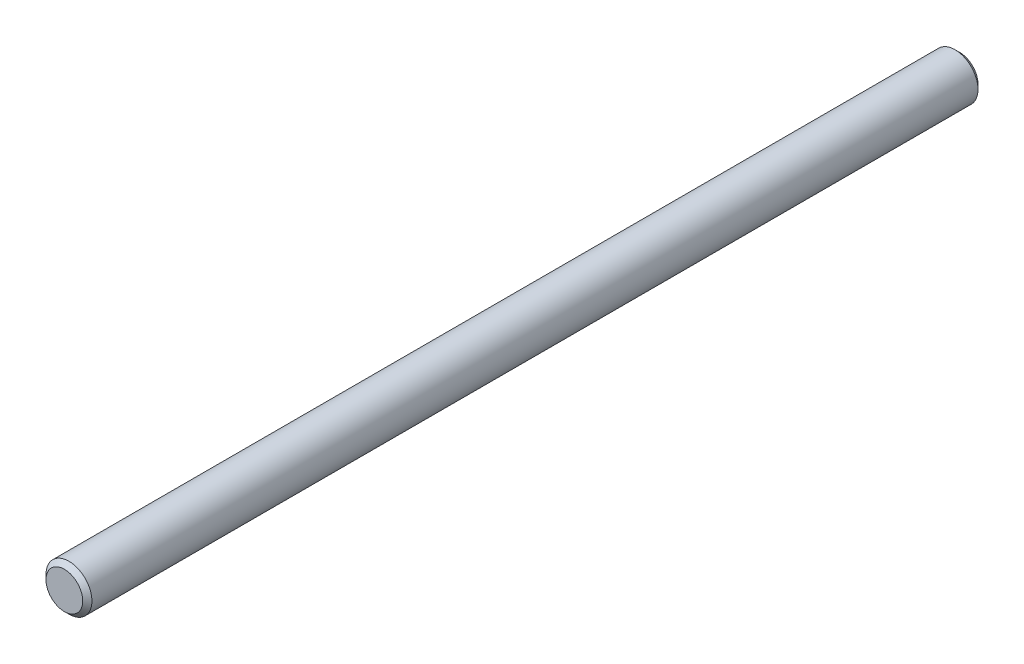
ISO-10303-21;
HEADER;
FILE_DESCRIPTION(('STEP AP214'),'2;1');
FILE_NAME('part.step','',(''),(''),'','','');
FILE_SCHEMA(('AUTOMOTIVE_DESIGN { 1 0 10303 214 1 1 1 1 }'));
ENDSEC;
DATA;
#1=APPLICATION_CONTEXT('core data for automotive mechanical design processes');
#2=APPLICATION_PROTOCOL_DEFINITION('international standard','automotive_design',2000,#1);
#3=PRODUCT_CONTEXT('',#1,'mechanical');
#4=PRODUCT('Part','Part','',(#3));
#5=PRODUCT_RELATED_PRODUCT_CATEGORY('part','',(#4));
#6=PRODUCT_DEFINITION_FORMATION('','',#4);
#7=PRODUCT_DEFINITION_CONTEXT('part definition',#1,'design');
#8=PRODUCT_DEFINITION('design','',#6,#7);
#9=PRODUCT_DEFINITION_SHAPE('','',#8);
#10=(LENGTH_UNIT() NAMED_UNIT(*) SI_UNIT(.MILLI.,.METRE.));
#11=(NAMED_UNIT(*) PLANE_ANGLE_UNIT() SI_UNIT($,.RADIAN.));
#12=(NAMED_UNIT(*) SI_UNIT($,.STERADIAN.) SOLID_ANGLE_UNIT());
#13=UNCERTAINTY_MEASURE_WITH_UNIT(LENGTH_MEASURE(1.E-05),#10,'distance_accuracy_value','');
#14=(GEOMETRIC_REPRESENTATION_CONTEXT(3) GLOBAL_UNCERTAINTY_ASSIGNED_CONTEXT((#13)) GLOBAL_UNIT_ASSIGNED_CONTEXT((#10,
#11,#12)) REPRESENTATION_CONTEXT('',''));
#15=CARTESIAN_POINT('',(0.,0.,0.));
#16=DIRECTION('',(0.,0.,1.));
#17=DIRECTION('',(1.,0.,0.));
#18=AXIS2_PLACEMENT_3D('',#15,#16,#17);
#19=CARTESIAN_POINT('',(0.,0.,19.5));
#20=DIRECTION('',(0.,0.,-1.));
#21=DIRECTION('',(-1.,0.,0.));
#22=AXIS2_PLACEMENT_3D('',#19,#20,#21);
#23=CYLINDRICAL_SURFACE('',#22,0.5);
#24=CARTESIAN_POINT('',(0.,0.,0.0999999999999994));
#25=DIRECTION('',(0.,0.,1.));
#26=DIRECTION('',(1.,0.,0.));
#27=AXIS2_PLACEMENT_3D('',#24,#25,#26);
#28=CIRCLE('',#27,0.5);
#29=CARTESIAN_POINT('',(0.5,0.,0.0999999999999994));
#30=VERTEX_POINT('',#29);
#31=EDGE_CURVE('E42',#30,#30,#28,.T.);
#32=ORIENTED_EDGE('',*,*,#31,.T.);
#33=EDGE_LOOP('',(#32));
#34=FACE_BOUND('',#33,.T.);
#35=CARTESIAN_POINT('',(0.,0.,19.4));
#36=DIRECTION('',(0.,0.,1.));
#37=DIRECTION('',(1.,0.,0.));
#38=AXIS2_PLACEMENT_3D('',#35,#36,#37);
#39=CIRCLE('',#38,0.5);
#40=CARTESIAN_POINT('',(0.5,0.,19.4));
#41=VERTEX_POINT('',#40);
#42=EDGE_CURVE('E46',#41,#41,#39,.F.);
#43=ORIENTED_EDGE('',*,*,#42,.T.);
#44=EDGE_LOOP('',(#43));
#45=FACE_BOUND('',#44,.T.);
#46=ADVANCED_FACE('F31',(#34,#45),#23,.T.);
#47=CARTESIAN_POINT('',(0.,0.,19.5));
#48=DIRECTION('',(0.,0.,1.));
#49=DIRECTION('',(1.,0.,0.));
#50=AXIS2_PLACEMENT_3D('',#47,#48,#49);
#51=PLANE('',#50);
#52=CARTESIAN_POINT('',(0.,0.,19.5));
#53=DIRECTION('',(0.,0.,1.));
#54=DIRECTION('',(1.,0.,0.));
#55=AXIS2_PLACEMENT_3D('',#52,#53,#54);
#56=CIRCLE('',#55,0.400000000000008);
#57=CARTESIAN_POINT('',(0.400000000000008,0.,19.5));
#58=VERTEX_POINT('',#57);
#59=EDGE_CURVE('E10',#58,#58,#56,.T.);
#60=ORIENTED_EDGE('',*,*,#59,.T.);
#61=EDGE_LOOP('',(#60));
#62=FACE_BOUND('',#61,.T.);
#63=ADVANCED_FACE('F62',(#62),#51,.T.);
#64=CARTESIAN_POINT('',(0.,0.,0.));
#65=DIRECTION('',(0.,0.,1.));
#66=DIRECTION('',(1.,0.,0.));
#67=AXIS2_PLACEMENT_3D('',#64,#65,#66);
#68=PLANE('',#67);
#69=CARTESIAN_POINT('',(0.,0.,0.));
#70=DIRECTION('',(0.,0.,1.));
#71=DIRECTION('',(1.,0.,0.));
#72=AXIS2_PLACEMENT_3D('',#69,#70,#71);
#73=CIRCLE('',#72,0.399999999999999);
#74=CARTESIAN_POINT('',(0.399999999999999,0.,0.));
#75=VERTEX_POINT('',#74);
#76=EDGE_CURVE('E38',#75,#75,#73,.F.);
#77=ORIENTED_EDGE('',*,*,#76,.T.);
#78=EDGE_LOOP('',(#77));
#79=FACE_BOUND('',#78,.T.);
#80=ADVANCED_FACE('F59',(#79),#68,.F.);
#81=CARTESIAN_POINT('',(0.,0.,0.0999999999999994));
#82=DIRECTION('',(0.,0.,1.));
#83=DIRECTION('',(1.,0.,0.));
#84=AXIS2_PLACEMENT_3D('',#81,#82,#83);
#85=CONICAL_SURFACE('',#84,0.5,0.785398163397455);
#86=ORIENTED_EDGE('',*,*,#76,.F.);
#87=EDGE_LOOP('',(#86));
#88=FACE_BOUND('',#87,.T.);
#89=ORIENTED_EDGE('',*,*,#31,.F.);
#90=EDGE_LOOP('',(#89));
#91=FACE_BOUND('',#90,.T.);
#92=ADVANCED_FACE('F55',(#88,#91),#85,.T.);
#93=CARTESIAN_POINT('',(0.,0.,19.5));
#94=DIRECTION('',(0.,0.,-1.));
#95=DIRECTION('',(-1.,0.,0.));
#96=AXIS2_PLACEMENT_3D('',#93,#94,#95);
#97=CONICAL_SURFACE('',#96,0.400000000000008,0.785398163397463);
#98=ORIENTED_EDGE('',*,*,#42,.F.);
#99=EDGE_LOOP('',(#98));
#100=FACE_BOUND('',#99,.T.);
#101=ORIENTED_EDGE('',*,*,#59,.F.);
#102=EDGE_LOOP('',(#101));
#103=FACE_BOUND('',#102,.T.);
#104=ADVANCED_FACE('F33',(#100,#103),#97,.T.);
#105=CLOSED_SHELL('',(#46,#63,#80,#92,#104));
#106=MANIFOLD_SOLID_BREP('B2',#105);
#107=ADVANCED_BREP_SHAPE_REPRESENTATION('',(#18,#106),#14);
#108=SHAPE_DEFINITION_REPRESENTATION(#9,#107);
ENDSEC;
END-ISO-10303-21;
